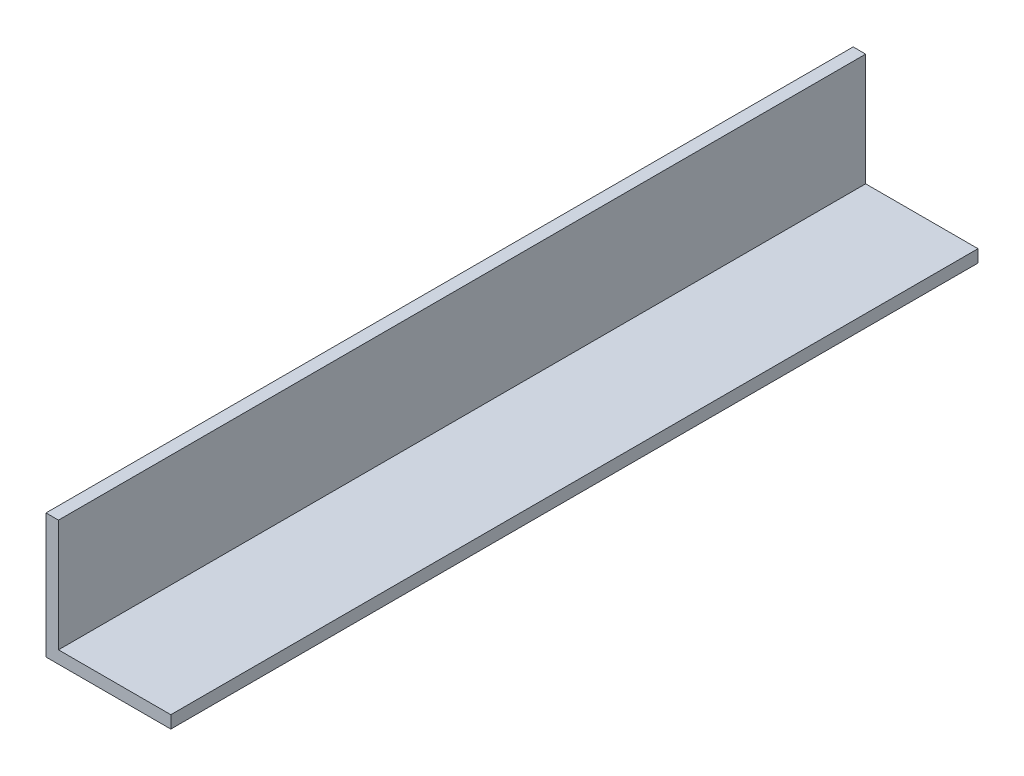
ISO-10303-21;
HEADER;
FILE_DESCRIPTION(('STEP AP214'),'2;1');
FILE_NAME('part.step','',(''),(''),'','','');
FILE_SCHEMA(('AUTOMOTIVE_DESIGN { 1 0 10303 214 1 1 1 1 }'));
ENDSEC;
DATA;
#1=APPLICATION_CONTEXT('core data for automotive mechanical design processes');
#2=APPLICATION_PROTOCOL_DEFINITION('international standard','automotive_design',2000,#1);
#3=PRODUCT_CONTEXT('',#1,'mechanical');
#4=PRODUCT('Part','Part','',(#3));
#5=PRODUCT_RELATED_PRODUCT_CATEGORY('part','',(#4));
#6=PRODUCT_DEFINITION_FORMATION('','',#4);
#7=PRODUCT_DEFINITION_CONTEXT('part definition',#1,'design');
#8=PRODUCT_DEFINITION('design','',#6,#7);
#9=PRODUCT_DEFINITION_SHAPE('','',#8);
#10=(LENGTH_UNIT() NAMED_UNIT(*) SI_UNIT(.MILLI.,.METRE.));
#11=(NAMED_UNIT(*) PLANE_ANGLE_UNIT() SI_UNIT($,.RADIAN.));
#12=(NAMED_UNIT(*) SI_UNIT($,.STERADIAN.) SOLID_ANGLE_UNIT());
#13=UNCERTAINTY_MEASURE_WITH_UNIT(LENGTH_MEASURE(1.E-05),#10,'distance_accuracy_value','');
#14=(GEOMETRIC_REPRESENTATION_CONTEXT(3) GLOBAL_UNCERTAINTY_ASSIGNED_CONTEXT((#13)) GLOBAL_UNIT_ASSIGNED_CONTEXT((#10,
#11,#12)) REPRESENTATION_CONTEXT('',''));
#15=CARTESIAN_POINT('',(0.,0.,0.));
#16=DIRECTION('',(0.,0.,1.));
#17=DIRECTION('',(1.,0.,0.));
#18=AXIS2_PLACEMENT_3D('',#15,#16,#17);
#19=CARTESIAN_POINT('',(0.,30.,194.));
#20=DIRECTION('',(1.,0.,0.));
#21=DIRECTION('',(0.,0.,-1.));
#22=AXIS2_PLACEMENT_3D('',#19,#20,#21);
#23=PLANE('',#22);
#24=DIRECTION('',(0.,-1.,0.));
#25=VECTOR('',#24,1.);
#26=CARTESIAN_POINT('',(0.,30.,0.));
#27=LINE('',#26,#25);
#28=CARTESIAN_POINT('',(0.,30.,0.));
#29=VERTEX_POINT('',#28);
#30=CARTESIAN_POINT('',(0.,0.,0.));
#31=VERTEX_POINT('',#30);
#32=EDGE_CURVE('E116',#29,#31,#27,.T.);
#33=ORIENTED_EDGE('',*,*,#32,.T.);
#34=DIRECTION('',(0.,0.,-1.));
#35=VECTOR('',#34,1.);
#36=CARTESIAN_POINT('',(0.,0.,194.));
#37=LINE('',#36,#35);
#38=CARTESIAN_POINT('',(0.,0.,194.));
#39=VERTEX_POINT('',#38);
#40=EDGE_CURVE('E11',#39,#31,#37,.T.);
#41=ORIENTED_EDGE('',*,*,#40,.F.);
#42=DIRECTION('',(0.,-1.,0.));
#43=VECTOR('',#42,1.);
#44=CARTESIAN_POINT('',(0.,30.,194.));
#45=LINE('',#44,#43);
#46=CARTESIAN_POINT('',(0.,30.,194.));
#47=VERTEX_POINT('',#46);
#48=EDGE_CURVE('E126',#47,#39,#45,.T.);
#49=ORIENTED_EDGE('',*,*,#48,.F.);
#50=DIRECTION('',(0.,0.,-1.));
#51=VECTOR('',#50,1.);
#52=CARTESIAN_POINT('',(0.,30.,194.));
#53=LINE('',#52,#51);
#54=EDGE_CURVE('E112',#47,#29,#53,.T.);
#55=ORIENTED_EDGE('',*,*,#54,.T.);
#56=EDGE_LOOP('',(#33,#41,#49,#55));
#57=FACE_BOUND('',#56,.T.);
#58=ADVANCED_FACE('F32',(#57),#23,.F.);
#59=CARTESIAN_POINT('',(0.,0.,194.));
#60=DIRECTION('',(0.,1.,0.));
#61=DIRECTION('',(-1.,0.,0.));
#62=AXIS2_PLACEMENT_3D('',#59,#60,#61);
#63=PLANE('',#62);
#64=DIRECTION('',(1.,0.,0.));
#65=VECTOR('',#64,1.);
#66=CARTESIAN_POINT('',(0.,0.,0.));
#67=LINE('',#66,#65);
#68=CARTESIAN_POINT('',(30.,0.,0.));
#69=VERTEX_POINT('',#68);
#70=EDGE_CURVE('E119',#31,#69,#67,.T.);
#71=ORIENTED_EDGE('',*,*,#70,.T.);
#72=DIRECTION('',(0.,0.,-1.));
#73=VECTOR('',#72,1.);
#74=CARTESIAN_POINT('',(30.,0.,194.));
#75=LINE('',#74,#73);
#76=CARTESIAN_POINT('',(30.,0.,194.));
#77=VERTEX_POINT('',#76);
#78=EDGE_CURVE('E40',#77,#69,#75,.T.);
#79=ORIENTED_EDGE('',*,*,#78,.F.);
#80=DIRECTION('',(1.,0.,0.));
#81=VECTOR('',#80,1.);
#82=CARTESIAN_POINT('',(0.,0.,194.));
#83=LINE('',#82,#81);
#84=EDGE_CURVE('E85',#39,#77,#83,.T.);
#85=ORIENTED_EDGE('',*,*,#84,.F.);
#86=ORIENTED_EDGE('',*,*,#40,.T.);
#87=EDGE_LOOP('',(#71,#79,#85,#86));
#88=FACE_BOUND('',#87,.T.);
#89=ADVANCED_FACE('F150',(#88),#63,.F.);
#90=CARTESIAN_POINT('',(30.,0.,194.));
#91=DIRECTION('',(-1.,0.,0.));
#92=DIRECTION('',(0.,0.,1.));
#93=AXIS2_PLACEMENT_3D('',#90,#91,#92);
#94=PLANE('',#93);
#95=DIRECTION('',(0.,1.,0.));
#96=VECTOR('',#95,1.);
#97=CARTESIAN_POINT('',(30.,0.,0.));
#98=LINE('',#97,#96);
#99=CARTESIAN_POINT('',(30.,3.,0.));
#100=VERTEX_POINT('',#99);
#101=EDGE_CURVE('E121',#69,#100,#98,.T.);
#102=ORIENTED_EDGE('',*,*,#101,.T.);
#103=DIRECTION('',(0.,0.,-1.));
#104=VECTOR('',#103,1.);
#105=CARTESIAN_POINT('',(30.,3.,194.));
#106=LINE('',#105,#104);
#107=CARTESIAN_POINT('',(30.,3.,194.));
#108=VERTEX_POINT('',#107);
#109=EDGE_CURVE('E107',#108,#100,#106,.T.);
#110=ORIENTED_EDGE('',*,*,#109,.F.);
#111=DIRECTION('',(0.,1.,0.));
#112=VECTOR('',#111,1.);
#113=CARTESIAN_POINT('',(30.,0.,194.));
#114=LINE('',#113,#112);
#115=EDGE_CURVE('E98',#77,#108,#114,.T.);
#116=ORIENTED_EDGE('',*,*,#115,.F.);
#117=ORIENTED_EDGE('',*,*,#78,.T.);
#118=EDGE_LOOP('',(#102,#110,#116,#117));
#119=FACE_BOUND('',#118,.T.);
#120=ADVANCED_FACE('F132',(#119),#94,.F.);
#121=CARTESIAN_POINT('',(30.,3.,194.));
#122=DIRECTION('',(0.,-1.,0.));
#123=DIRECTION('',(1.,0.,0.));
#124=AXIS2_PLACEMENT_3D('',#121,#122,#123);
#125=PLANE('',#124);
#126=DIRECTION('',(-1.,0.,0.));
#127=VECTOR('',#126,1.);
#128=CARTESIAN_POINT('',(30.,3.,0.));
#129=LINE('',#128,#127);
#130=CARTESIAN_POINT('',(3.,3.,0.));
#131=VERTEX_POINT('',#130);
#132=EDGE_CURVE('E106',#100,#131,#129,.T.);
#133=ORIENTED_EDGE('',*,*,#132,.T.);
#134=DIRECTION('',(0.,0.,-1.));
#135=VECTOR('',#134,1.);
#136=CARTESIAN_POINT('',(3.,3.,194.));
#137=LINE('',#136,#135);
#138=CARTESIAN_POINT('',(3.,3.,194.));
#139=VERTEX_POINT('',#138);
#140=EDGE_CURVE('E103',#139,#131,#137,.T.);
#141=ORIENTED_EDGE('',*,*,#140,.F.);
#142=DIRECTION('',(-1.,0.,0.));
#143=VECTOR('',#142,1.);
#144=CARTESIAN_POINT('',(30.,3.,194.));
#145=LINE('',#144,#143);
#146=EDGE_CURVE('E92',#108,#139,#145,.T.);
#147=ORIENTED_EDGE('',*,*,#146,.F.);
#148=ORIENTED_EDGE('',*,*,#109,.T.);
#149=EDGE_LOOP('',(#133,#141,#147,#148));
#150=FACE_BOUND('',#149,.T.);
#151=ADVANCED_FACE('F104',(#150),#125,.F.);
#152=CARTESIAN_POINT('',(3.,3.,194.));
#153=DIRECTION('',(-1.,0.,0.));
#154=DIRECTION('',(0.,0.,1.));
#155=AXIS2_PLACEMENT_3D('',#152,#153,#154);
#156=PLANE('',#155);
#157=DIRECTION('',(0.,1.,0.));
#158=VECTOR('',#157,1.);
#159=CARTESIAN_POINT('',(3.,3.,0.));
#160=LINE('',#159,#158);
#161=CARTESIAN_POINT('',(3.,30.,0.));
#162=VERTEX_POINT('',#161);
#163=EDGE_CURVE('E71',#131,#162,#160,.T.);
#164=ORIENTED_EDGE('',*,*,#163,.T.);
#165=DIRECTION('',(0.,0.,-1.));
#166=VECTOR('',#165,1.);
#167=CARTESIAN_POINT('',(3.,30.,194.));
#168=LINE('',#167,#166);
#169=CARTESIAN_POINT('',(3.,30.,194.));
#170=VERTEX_POINT('',#169);
#171=EDGE_CURVE('E108',#170,#162,#168,.T.);
#172=ORIENTED_EDGE('',*,*,#171,.F.);
#173=DIRECTION('',(0.,1.,0.));
#174=VECTOR('',#173,1.);
#175=CARTESIAN_POINT('',(3.,3.,194.));
#176=LINE('',#175,#174);
#177=EDGE_CURVE('E96',#139,#170,#176,.T.);
#178=ORIENTED_EDGE('',*,*,#177,.F.);
#179=ORIENTED_EDGE('',*,*,#140,.T.);
#180=EDGE_LOOP('',(#164,#172,#178,#179));
#181=FACE_BOUND('',#180,.T.);
#182=ADVANCED_FACE('F110',(#181),#156,.F.);
#183=CARTESIAN_POINT('',(3.,30.,194.));
#184=DIRECTION('',(0.,-1.,0.));
#185=DIRECTION('',(0.,0.,-1.));
#186=AXIS2_PLACEMENT_3D('',#183,#184,#185);
#187=PLANE('',#186);
#188=DIRECTION('',(-1.,0.,0.));
#189=VECTOR('',#188,1.);
#190=CARTESIAN_POINT('',(3.,30.,0.));
#191=LINE('',#190,#189);
#192=EDGE_CURVE('E77',#162,#29,#191,.T.);
#193=ORIENTED_EDGE('',*,*,#192,.T.);
#194=ORIENTED_EDGE('',*,*,#54,.F.);
#195=DIRECTION('',(-1.,0.,0.));
#196=VECTOR('',#195,1.);
#197=CARTESIAN_POINT('',(3.,30.,194.));
#198=LINE('',#197,#196);
#199=EDGE_CURVE('E48',#170,#47,#198,.T.);
#200=ORIENTED_EDGE('',*,*,#199,.F.);
#201=ORIENTED_EDGE('',*,*,#171,.T.);
#202=EDGE_LOOP('',(#193,#194,#200,#201));
#203=FACE_BOUND('',#202,.T.);
#204=ADVANCED_FACE('F139',(#203),#187,.F.);
#205=CARTESIAN_POINT('',(0.,0.,194.));
#206=DIRECTION('',(0.,0.,1.));
#207=DIRECTION('',(1.,0.,0.));
#208=AXIS2_PLACEMENT_3D('',#205,#206,#207);
#209=PLANE('',#208);
#210=ORIENTED_EDGE('',*,*,#48,.T.);
#211=ORIENTED_EDGE('',*,*,#84,.T.);
#212=ORIENTED_EDGE('',*,*,#115,.T.);
#213=ORIENTED_EDGE('',*,*,#146,.T.);
#214=ORIENTED_EDGE('',*,*,#177,.T.);
#215=ORIENTED_EDGE('',*,*,#199,.T.);
#216=EDGE_LOOP('',(#210,#211,#212,#213,#214,#215));
#217=FACE_BOUND('',#216,.T.);
#218=ADVANCED_FACE('F94',(#217),#209,.T.);
#219=CARTESIAN_POINT('',(0.,0.,0.));
#220=DIRECTION('',(0.,0.,1.));
#221=DIRECTION('',(1.,0.,0.));
#222=AXIS2_PLACEMENT_3D('',#219,#220,#221);
#223=PLANE('',#222);
#224=ORIENTED_EDGE('',*,*,#32,.F.);
#225=ORIENTED_EDGE('',*,*,#192,.F.);
#226=ORIENTED_EDGE('',*,*,#163,.F.);
#227=ORIENTED_EDGE('',*,*,#132,.F.);
#228=ORIENTED_EDGE('',*,*,#101,.F.);
#229=ORIENTED_EDGE('',*,*,#70,.F.);
#230=EDGE_LOOP('',(#224,#225,#226,#227,#228,#229));
#231=FACE_BOUND('',#230,.T.);
#232=ADVANCED_FACE('F135',(#231),#223,.F.);
#233=CLOSED_SHELL('',(#58,#89,#120,#151,#182,#204,#218,#232));
#234=MANIFOLD_SOLID_BREP('B2',#233);
#235=ADVANCED_BREP_SHAPE_REPRESENTATION('',(#18,#234),#14);
#236=SHAPE_DEFINITION_REPRESENTATION(#9,#235);
ENDSEC;
END-ISO-10303-21;
